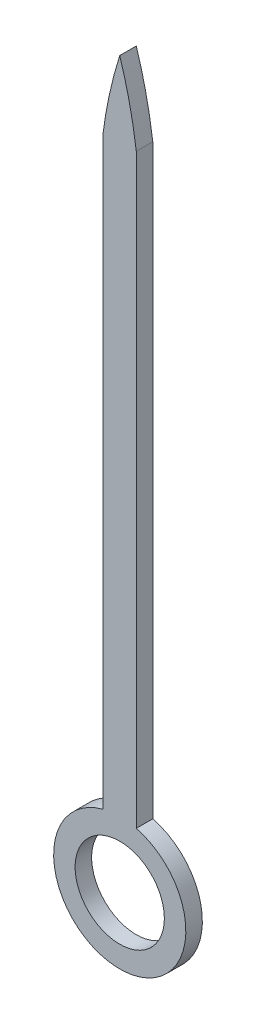
ISO-10303-21;
HEADER;
FILE_DESCRIPTION(('STEP AP214'),'2;1');
FILE_NAME('part.step','',(''),(''),'','','');
FILE_SCHEMA(('AUTOMOTIVE_DESIGN { 1 0 10303 214 1 1 1 1 }'));
ENDSEC;
DATA;
#1=APPLICATION_CONTEXT('core data for automotive mechanical design processes');
#2=APPLICATION_PROTOCOL_DEFINITION('international standard','automotive_design',2000,#1);
#3=PRODUCT_CONTEXT('',#1,'mechanical');
#4=PRODUCT('Part','Part','',(#3));
#5=PRODUCT_RELATED_PRODUCT_CATEGORY('part','',(#4));
#6=PRODUCT_DEFINITION_FORMATION('','',#4);
#7=PRODUCT_DEFINITION_CONTEXT('part definition',#1,'design');
#8=PRODUCT_DEFINITION('design','',#6,#7);
#9=PRODUCT_DEFINITION_SHAPE('','',#8);
#10=(LENGTH_UNIT() NAMED_UNIT(*) SI_UNIT(.MILLI.,.METRE.));
#11=(NAMED_UNIT(*) PLANE_ANGLE_UNIT() SI_UNIT($,.RADIAN.));
#12=(NAMED_UNIT(*) SI_UNIT($,.STERADIAN.) SOLID_ANGLE_UNIT());
#13=UNCERTAINTY_MEASURE_WITH_UNIT(LENGTH_MEASURE(1.E-05),#10,'distance_accuracy_value','');
#14=(GEOMETRIC_REPRESENTATION_CONTEXT(3) GLOBAL_UNCERTAINTY_ASSIGNED_CONTEXT((#13)) GLOBAL_UNIT_ASSIGNED_CONTEXT((#10,
#11,#12)) REPRESENTATION_CONTEXT('',''));
#15=CARTESIAN_POINT('',(0.,0.,0.));
#16=DIRECTION('',(0.,0.,1.));
#17=DIRECTION('',(1.,0.,0.));
#18=AXIS2_PLACEMENT_3D('',#15,#16,#17);
#19=CARTESIAN_POINT('',(0.,0.,1.5));
#20=DIRECTION('',(0.,0.,1.));
#21=DIRECTION('',(1.,0.,0.));
#22=AXIS2_PLACEMENT_3D('',#19,#20,#21);
#23=PLANE('',#22);
#24=CARTESIAN_POINT('',(0.,0.,1.5));
#25=DIRECTION('',(0.,0.,1.));
#26=DIRECTION('',(1.,0.,0.));
#27=AXIS2_PLACEMENT_3D('',#24,#25,#26);
#28=CIRCLE('',#27,6.);
#29=CARTESIAN_POINT('',(-1.5,5.80947501931113,1.5));
#30=VERTEX_POINT('',#29);
#31=CARTESIAN_POINT('',(1.5,5.80947501931112,1.5));
#32=VERTEX_POINT('',#31);
#33=EDGE_CURVE('E159',#30,#32,#28,.T.);
#34=ORIENTED_EDGE('',*,*,#33,.T.);
#35=DIRECTION('',(0.,1.,0.));
#36=VECTOR('',#35,1.);
#37=CARTESIAN_POINT('',(1.5,5.80947501931112,1.5));
#38=LINE('',#37,#36);
#39=CARTESIAN_POINT('',(1.5,59.0371168468918,1.5));
#40=VERTEX_POINT('',#39);
#41=EDGE_CURVE('E87',#32,#40,#38,.T.);
#42=ORIENTED_EDGE('',*,*,#41,.T.);
#43=CARTESIAN_POINT('',(1.5,59.0371168468918,1.5));
#44=CARTESIAN_POINT('',(1.05147295295555,62.4871621142696,1.5));
#45=CARTESIAN_POINT('',(0.,65.8094750193111,1.5));
#46=B_SPLINE_CURVE_WITH_KNOTS('',2,(#43,#44,#45),.UNSPECIFIED.,.F.,.F.,(3,3),(0.,1.),.UNSPECIFIED.);
#47=CARTESIAN_POINT('',(0.,65.8094750193111,1.5));
#48=VERTEX_POINT('',#47);
#49=EDGE_CURVE('E91',#40,#48,#46,.T.);
#50=ORIENTED_EDGE('',*,*,#49,.T.);
#51=CARTESIAN_POINT('',(0.,65.8094750193111,1.5));
#52=CARTESIAN_POINT('',(-1.05147295295555,62.4871621142696,1.5));
#53=CARTESIAN_POINT('',(-1.5,59.0371168468918,1.5));
#54=B_SPLINE_CURVE_WITH_KNOTS('',2,(#51,#52,#53),.UNSPECIFIED.,.F.,.F.,(3,3),(0.,1.),.UNSPECIFIED.);
#55=CARTESIAN_POINT('',(-1.5,59.0371168468918,1.5));
#56=VERTEX_POINT('',#55);
#57=EDGE_CURVE('E95',#48,#56,#54,.T.);
#58=ORIENTED_EDGE('',*,*,#57,.T.);
#59=DIRECTION('',(0.,-1.,0.));
#60=VECTOR('',#59,1.);
#61=CARTESIAN_POINT('',(-1.5,5.80947501931113,1.5));
#62=LINE('',#61,#60);
#63=EDGE_CURVE('E53',#56,#30,#62,.T.);
#64=ORIENTED_EDGE('',*,*,#63,.T.);
#65=EDGE_LOOP('',(#34,#42,#50,#58,#64));
#66=FACE_BOUND('',#65,.T.);
#67=CARTESIAN_POINT('',(0.,0.,1.5));
#68=DIRECTION('',(0.,0.,1.));
#69=DIRECTION('',(1.,0.,0.));
#70=AXIS2_PLACEMENT_3D('',#67,#68,#69);
#71=CIRCLE('',#70,4.05);
#72=CARTESIAN_POINT('',(4.05,0.,1.5));
#73=VERTEX_POINT('',#72);
#74=EDGE_CURVE('E150',#73,#73,#71,.T.);
#75=ORIENTED_EDGE('',*,*,#74,.F.);
#76=EDGE_LOOP('',(#75));
#77=FACE_BOUND('',#76,.T.);
#78=ADVANCED_FACE('F36',(#66,#77),#23,.T.);
#79=CARTESIAN_POINT('',(0.,0.,0.));
#80=DIRECTION('',(0.,0.,1.));
#81=DIRECTION('',(1.,0.,0.));
#82=AXIS2_PLACEMENT_3D('',#79,#80,#81);
#83=PLANE('',#82);
#84=CARTESIAN_POINT('',(0.,0.,0.));
#85=DIRECTION('',(0.,0.,1.));
#86=DIRECTION('',(1.,0.,0.));
#87=AXIS2_PLACEMENT_3D('',#84,#85,#86);
#88=CIRCLE('',#87,6.);
#89=CARTESIAN_POINT('',(-1.5,5.80947501931113,0.));
#90=VERTEX_POINT('',#89);
#91=CARTESIAN_POINT('',(1.5,5.80947501931112,0.));
#92=VERTEX_POINT('',#91);
#93=EDGE_CURVE('E156',#90,#92,#88,.T.);
#94=ORIENTED_EDGE('',*,*,#93,.F.);
#95=DIRECTION('',(0.,-1.,0.));
#96=VECTOR('',#95,1.);
#97=CARTESIAN_POINT('',(-1.5,5.80947501931113,0.));
#98=LINE('',#97,#96);
#99=CARTESIAN_POINT('',(-1.5,59.0371168468918,0.));
#100=VERTEX_POINT('',#99);
#101=EDGE_CURVE('E79',#100,#90,#98,.T.);
#102=ORIENTED_EDGE('',*,*,#101,.F.);
#103=CARTESIAN_POINT('',(0.,65.8094750193111,0.));
#104=CARTESIAN_POINT('',(-1.05147295295555,62.4871621142696,0.));
#105=CARTESIAN_POINT('',(-1.5,59.0371168468918,0.));
#106=B_SPLINE_CURVE_WITH_KNOTS('',2,(#103,#104,#105),.UNSPECIFIED.,.F.,.F.,(3,3),(0.,1.),.UNSPECIFIED.);
#107=CARTESIAN_POINT('',(0.,65.8094750193111,0.));
#108=VERTEX_POINT('',#107);
#109=EDGE_CURVE('E73',#108,#100,#106,.T.);
#110=ORIENTED_EDGE('',*,*,#109,.F.);
#111=CARTESIAN_POINT('',(1.5,59.0371168468918,0.));
#112=CARTESIAN_POINT('',(1.05147295295555,62.4871621142696,0.));
#113=CARTESIAN_POINT('',(0.,65.8094750193111,0.));
#114=B_SPLINE_CURVE_WITH_KNOTS('',2,(#111,#112,#113),.UNSPECIFIED.,.F.,.F.,(3,3),(0.,1.),.UNSPECIFIED.);
#115=CARTESIAN_POINT('',(1.5,59.0371168468918,0.));
#116=VERTEX_POINT('',#115);
#117=EDGE_CURVE('E102',#116,#108,#114,.T.);
#118=ORIENTED_EDGE('',*,*,#117,.F.);
#119=DIRECTION('',(0.,1.,0.));
#120=VECTOR('',#119,1.);
#121=CARTESIAN_POINT('',(1.5,5.80947501931112,0.));
#122=LINE('',#121,#120);
#123=EDGE_CURVE('E170',#92,#116,#122,.T.);
#124=ORIENTED_EDGE('',*,*,#123,.F.);
#125=EDGE_LOOP('',(#94,#102,#110,#118,#124));
#126=FACE_BOUND('',#125,.T.);
#127=CARTESIAN_POINT('',(0.,0.,0.));
#128=DIRECTION('',(0.,0.,1.));
#129=DIRECTION('',(1.,0.,0.));
#130=AXIS2_PLACEMENT_3D('',#127,#128,#129);
#131=CIRCLE('',#130,4.05);
#132=CARTESIAN_POINT('',(4.05,0.,0.));
#133=VERTEX_POINT('',#132);
#134=EDGE_CURVE('E153',#133,#133,#131,.T.);
#135=ORIENTED_EDGE('',*,*,#134,.T.);
#136=EDGE_LOOP('',(#135));
#137=FACE_BOUND('',#136,.T.);
#138=ADVANCED_FACE('F132',(#126,#137),#83,.F.);
#139=CARTESIAN_POINT('',(0.,0.,1.5));
#140=DIRECTION('',(0.,0.,-1.));
#141=DIRECTION('',(-1.,0.,0.));
#142=AXIS2_PLACEMENT_3D('',#139,#140,#141);
#143=CYLINDRICAL_SURFACE('',#142,6.);
#144=ORIENTED_EDGE('',*,*,#93,.T.);
#145=DIRECTION('',(0.,0.,-1.));
#146=VECTOR('',#145,1.);
#147=CARTESIAN_POINT('',(1.5,5.80947501931112,1.5));
#148=LINE('',#147,#146);
#149=EDGE_CURVE('E11',#32,#92,#148,.T.);
#150=ORIENTED_EDGE('',*,*,#149,.F.);
#151=ORIENTED_EDGE('',*,*,#33,.F.);
#152=DIRECTION('',(0.,0.,-1.));
#153=VECTOR('',#152,1.);
#154=CARTESIAN_POINT('',(-1.5,5.80947501931113,1.5));
#155=LINE('',#154,#153);
#156=EDGE_CURVE('E107',#30,#90,#155,.T.);
#157=ORIENTED_EDGE('',*,*,#156,.T.);
#158=EDGE_LOOP('',(#144,#150,#151,#157));
#159=FACE_BOUND('',#158,.T.);
#160=ADVANCED_FACE('F38',(#159),#143,.T.);
#161=CARTESIAN_POINT('',(1.5,5.80947501931112,1.5));
#162=DIRECTION('',(-1.,0.,0.));
#163=DIRECTION('',(0.,0.,1.));
#164=AXIS2_PLACEMENT_3D('',#161,#162,#163);
#165=PLANE('',#164);
#166=ORIENTED_EDGE('',*,*,#123,.T.);
#167=DIRECTION('',(0.,0.,-1.));
#168=VECTOR('',#167,1.);
#169=CARTESIAN_POINT('',(1.5,59.0371168468918,1.5));
#170=LINE('',#169,#168);
#171=EDGE_CURVE('E45',#40,#116,#170,.T.);
#172=ORIENTED_EDGE('',*,*,#171,.F.);
#173=ORIENTED_EDGE('',*,*,#41,.F.);
#174=ORIENTED_EDGE('',*,*,#149,.T.);
#175=EDGE_LOOP('',(#166,#172,#173,#174));
#176=FACE_BOUND('',#175,.T.);
#177=ADVANCED_FACE('F127',(#176),#165,.F.);
#178=DIRECTION('',(0.,0.,-1.));
#179=VECTOR('',#178,1.);
#180=SURFACE_OF_LINEAR_EXTRUSION('',#46,#179);
#181=ORIENTED_EDGE('',*,*,#117,.T.);
#182=DIRECTION('',(0.,0.,-1.));
#183=VECTOR('',#182,1.);
#184=CARTESIAN_POINT('',(0.,65.8094750193111,1.5));
#185=LINE('',#184,#183);
#186=EDGE_CURVE('E99',#48,#108,#185,.T.);
#187=ORIENTED_EDGE('',*,*,#186,.F.);
#188=ORIENTED_EDGE('',*,*,#49,.F.);
#189=ORIENTED_EDGE('',*,*,#171,.T.);
#190=EDGE_LOOP('',(#181,#187,#188,#189));
#191=FACE_BOUND('',#190,.T.);
#192=ADVANCED_FACE('F100',(#191),#180,.F.);
#193=DIRECTION('',(0.,0.,-1.));
#194=VECTOR('',#193,1.);
#195=SURFACE_OF_LINEAR_EXTRUSION('',#54,#194);
#196=ORIENTED_EDGE('',*,*,#109,.T.);
#197=DIRECTION('',(0.,0.,-1.));
#198=VECTOR('',#197,1.);
#199=CARTESIAN_POINT('',(-1.5,59.0371168468918,1.5));
#200=LINE('',#199,#198);
#201=EDGE_CURVE('E103',#56,#100,#200,.T.);
#202=ORIENTED_EDGE('',*,*,#201,.F.);
#203=ORIENTED_EDGE('',*,*,#57,.F.);
#204=ORIENTED_EDGE('',*,*,#186,.T.);
#205=EDGE_LOOP('',(#196,#202,#203,#204));
#206=FACE_BOUND('',#205,.T.);
#207=ADVANCED_FACE('F105',(#206),#195,.F.);
#208=CARTESIAN_POINT('',(-1.5,5.80947501931113,1.5));
#209=DIRECTION('',(1.,0.,0.));
#210=DIRECTION('',(0.,0.,-1.));
#211=AXIS2_PLACEMENT_3D('',#208,#209,#210);
#212=PLANE('',#211);
#213=ORIENTED_EDGE('',*,*,#101,.T.);
#214=ORIENTED_EDGE('',*,*,#156,.F.);
#215=ORIENTED_EDGE('',*,*,#63,.F.);
#216=ORIENTED_EDGE('',*,*,#201,.T.);
#217=EDGE_LOOP('',(#213,#214,#215,#216));
#218=FACE_BOUND('',#217,.T.);
#219=ADVANCED_FACE('F124',(#218),#212,.F.);
#220=CARTESIAN_POINT('',(0.,0.,1.5));
#221=DIRECTION('',(0.,0.,-1.));
#222=DIRECTION('',(-1.,0.,0.));
#223=AXIS2_PLACEMENT_3D('',#220,#221,#222);
#224=CYLINDRICAL_SURFACE('',#223,4.05);
#225=ORIENTED_EDGE('',*,*,#74,.T.);
#226=EDGE_LOOP('',(#225));
#227=FACE_BOUND('',#226,.T.);
#228=ORIENTED_EDGE('',*,*,#134,.F.);
#229=EDGE_LOOP('',(#228));
#230=FACE_BOUND('',#229,.T.);
#231=ADVANCED_FACE('F141',(#227,#230),#224,.F.);
#232=CLOSED_SHELL('',(#78,#138,#160,#177,#192,#207,#219,#231));
#233=MANIFOLD_SOLID_BREP('B2',#232);
#234=ADVANCED_BREP_SHAPE_REPRESENTATION('',(#18,#233),#14);
#235=SHAPE_DEFINITION_REPRESENTATION(#9,#234);
ENDSEC;
END-ISO-10303-21;
